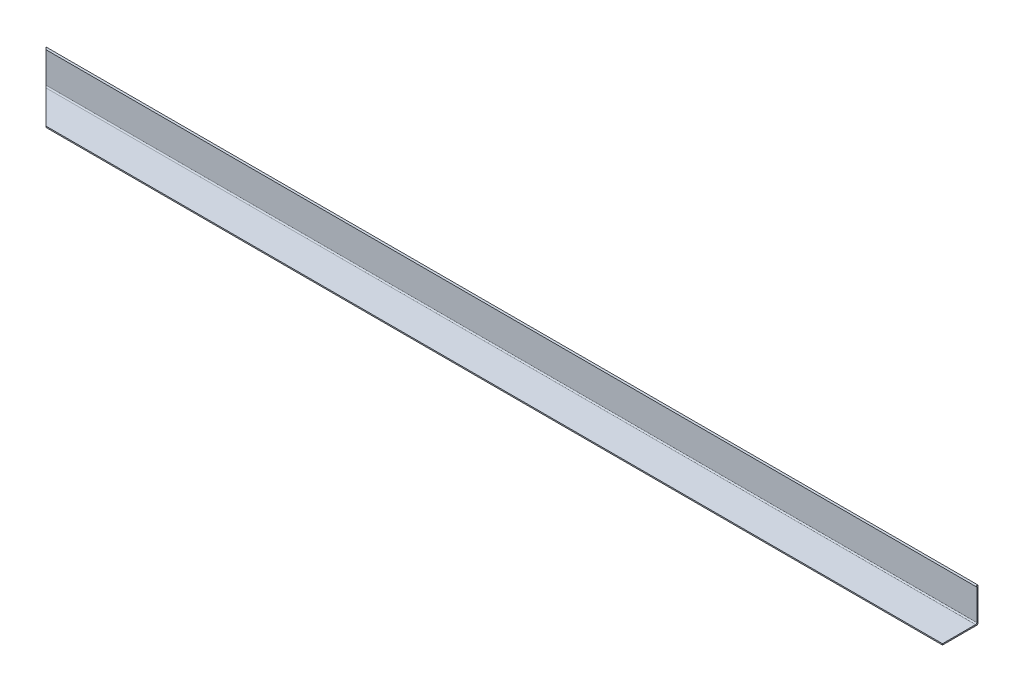
ISO-10303-21;
HEADER;
FILE_DESCRIPTION(('STEP AP214'),'2;1');
FILE_NAME('part.step','',(''),(''),'','','');
FILE_SCHEMA(('AUTOMOTIVE_DESIGN { 1 0 10303 214 1 1 1 1 }'));
ENDSEC;
DATA;
#1=APPLICATION_CONTEXT('core data for automotive mechanical design processes');
#2=APPLICATION_PROTOCOL_DEFINITION('international standard','automotive_design',2000,#1);
#3=PRODUCT_CONTEXT('',#1,'mechanical');
#4=PRODUCT('Part','Part','',(#3));
#5=PRODUCT_RELATED_PRODUCT_CATEGORY('part','',(#4));
#6=PRODUCT_DEFINITION_FORMATION('','',#4);
#7=PRODUCT_DEFINITION_CONTEXT('part definition',#1,'design');
#8=PRODUCT_DEFINITION('design','',#6,#7);
#9=PRODUCT_DEFINITION_SHAPE('','',#8);
#10=(LENGTH_UNIT() NAMED_UNIT(*) SI_UNIT(.MILLI.,.METRE.));
#11=(NAMED_UNIT(*) PLANE_ANGLE_UNIT() SI_UNIT($,.RADIAN.));
#12=(NAMED_UNIT(*) SI_UNIT($,.STERADIAN.) SOLID_ANGLE_UNIT());
#13=UNCERTAINTY_MEASURE_WITH_UNIT(LENGTH_MEASURE(1.E-05),#10,'distance_accuracy_value','');
#14=(GEOMETRIC_REPRESENTATION_CONTEXT(3) GLOBAL_UNCERTAINTY_ASSIGNED_CONTEXT((#13)) GLOBAL_UNIT_ASSIGNED_CONTEXT((#10,
#11,#12)) REPRESENTATION_CONTEXT('',''));
#15=CARTESIAN_POINT('',(0.,0.,0.));
#16=DIRECTION('',(0.,0.,1.));
#17=DIRECTION('',(1.,0.,0.));
#18=AXIS2_PLACEMENT_3D('',#15,#16,#17);
#19=CARTESIAN_POINT('',(2310.,0.,0.));
#20=DIRECTION('',(0.,0.,-1.));
#21=DIRECTION('',(-1.,0.,0.));
#22=AXIS2_PLACEMENT_3D('',#19,#20,#21);
#23=PLANE('',#22);
#24=DIRECTION('',(-1.,0.,0.));
#25=VECTOR('',#24,1.);
#26=CARTESIAN_POINT('',(2310.,0.,0.));
#27=LINE('',#26,#25);
#28=CARTESIAN_POINT('',(2310.,0.,0.));
#29=VERTEX_POINT('',#28);
#30=CARTESIAN_POINT('',(87.9999999999992,0.,0.));
#31=VERTEX_POINT('',#30);
#32=EDGE_CURVE('E138',#29,#31,#27,.T.);
#33=ORIENTED_EDGE('',*,*,#32,.T.);
#34=DIRECTION('',(0.,-1.,0.));
#35=VECTOR('',#34,1.);
#36=CARTESIAN_POINT('',(87.9999999999992,82.,0.));
#37=LINE('',#36,#35);
#38=CARTESIAN_POINT('',(87.9999999999992,-3.,0.));
#39=VERTEX_POINT('',#38);
#40=EDGE_CURVE('E179',#31,#39,#37,.T.);
#41=ORIENTED_EDGE('',*,*,#40,.T.);
#42=DIRECTION('',(-1.,0.,0.));
#43=VECTOR('',#42,1.);
#44=CARTESIAN_POINT('',(2310.,-3.,0.));
#45=LINE('',#44,#43);
#46=CARTESIAN_POINT('',(2310.,-3.,0.));
#47=VERTEX_POINT('',#46);
#48=EDGE_CURVE('E122',#47,#39,#45,.T.);
#49=ORIENTED_EDGE('',*,*,#48,.F.);
#50=DIRECTION('',(0.,-1.,0.));
#51=VECTOR('',#50,1.);
#52=CARTESIAN_POINT('',(2310.,0.,0.));
#53=LINE('',#52,#51);
#54=EDGE_CURVE('E133',#29,#47,#53,.T.);
#55=ORIENTED_EDGE('',*,*,#54,.F.);
#56=EDGE_LOOP('',(#33,#41,#49,#55));
#57=FACE_BOUND('',#56,.T.);
#58=ADVANCED_FACE('F33',(#57),#23,.F.);
#59=CARTESIAN_POINT('',(2310.,-3.,0.));
#60=DIRECTION('',(0.,1.,0.));
#61=DIRECTION('',(0.,0.,1.));
#62=AXIS2_PLACEMENT_3D('',#59,#60,#61);
#63=PLANE('',#62);
#64=ORIENTED_EDGE('',*,*,#48,.T.);
#65=DIRECTION('',(0.707106781186544,0.,0.707106781186551));
#66=VECTOR('',#65,1.);
#67=CARTESIAN_POINT('',(0.,-3.,-88.));
#68=LINE('',#67,#66);
#69=CARTESIAN_POINT('',(3.00000000000009,-3.,-84.9999999999999));
#70=VERTEX_POINT('',#69);
#71=EDGE_CURVE('E111',#70,#39,#68,.T.);
#72=ORIENTED_EDGE('',*,*,#71,.F.);
#73=DIRECTION('',(-1.,0.,0.));
#74=VECTOR('',#73,1.);
#75=CARTESIAN_POINT('',(2310.,-3.,-85.));
#76=LINE('',#75,#74);
#77=CARTESIAN_POINT('',(2310.,-3.,-85.));
#78=VERTEX_POINT('',#77);
#79=EDGE_CURVE('E146',#70,#78,#76,.F.);
#80=ORIENTED_EDGE('',*,*,#79,.T.);
#81=DIRECTION('',(0.,0.,-1.));
#82=VECTOR('',#81,1.);
#83=CARTESIAN_POINT('',(2310.,-3.,0.));
#84=LINE('',#83,#82);
#85=EDGE_CURVE('E129',#47,#78,#84,.T.);
#86=ORIENTED_EDGE('',*,*,#85,.F.);
#87=EDGE_LOOP('',(#64,#72,#80,#86));
#88=FACE_BOUND('',#87,.T.);
#89=ADVANCED_FACE('F182',(#88),#63,.F.);
#90=CARTESIAN_POINT('',(2310.,-3.,-88.));
#91=DIRECTION('',(0.,0.,1.));
#92=DIRECTION('',(1.,0.,0.));
#93=AXIS2_PLACEMENT_3D('',#90,#91,#92);
#94=PLANE('',#93);
#95=DIRECTION('',(0.,1.,0.));
#96=VECTOR('',#95,1.);
#97=CARTESIAN_POINT('',(2310.,-3.,-88.));
#98=LINE('',#97,#96);
#99=CARTESIAN_POINT('',(2310.,0.,-88.));
#100=VERTEX_POINT('',#99);
#101=CARTESIAN_POINT('',(2310.,82.,-88.));
#102=VERTEX_POINT('',#101);
#103=EDGE_CURVE('E118',#100,#102,#98,.T.);
#104=ORIENTED_EDGE('',*,*,#103,.F.);
#105=DIRECTION('',(-1.,0.,0.));
#106=VECTOR('',#105,1.);
#107=CARTESIAN_POINT('',(2310.,0.,-88.));
#108=LINE('',#107,#106);
#109=CARTESIAN_POINT('',(1.40946282423116E-13,0.,-88.));
#110=VERTEX_POINT('',#109);
#111=EDGE_CURVE('E121',#100,#110,#108,.T.);
#112=ORIENTED_EDGE('',*,*,#111,.T.);
#113=DIRECTION('',(0.,1.,0.));
#114=VECTOR('',#113,1.);
#115=CARTESIAN_POINT('',(0.,-3.,-88.));
#116=LINE('',#115,#114);
#117=CARTESIAN_POINT('',(0.,82.,-88.));
#118=VERTEX_POINT('',#117);
#119=EDGE_CURVE('E120',#110,#118,#116,.T.);
#120=ORIENTED_EDGE('',*,*,#119,.T.);
#121=DIRECTION('',(-1.,0.,0.));
#122=VECTOR('',#121,1.);
#123=CARTESIAN_POINT('',(2310.,82.,-88.));
#124=LINE('',#123,#122);
#125=EDGE_CURVE('E105',#118,#102,#124,.F.);
#126=ORIENTED_EDGE('',*,*,#125,.T.);
#127=EDGE_LOOP('',(#104,#112,#120,#126));
#128=FACE_BOUND('',#127,.T.);
#129=ADVANCED_FACE('F116',(#128),#94,.F.);
#130=CARTESIAN_POINT('',(2310.,0.,-85.));
#131=DIRECTION('',(0.,0.,-1.));
#132=DIRECTION('',(-1.,0.,0.));
#133=AXIS2_PLACEMENT_3D('',#130,#131,#132);
#134=PLANE('',#133);
#135=DIRECTION('',(-1.,0.,0.));
#136=VECTOR('',#135,1.);
#137=CARTESIAN_POINT('',(0.,79.,-85.));
#138=LINE('',#137,#136);
#139=CARTESIAN_POINT('',(2310.,79.,-85.));
#140=VERTEX_POINT('',#139);
#141=CARTESIAN_POINT('',(3.00000000000011,79.,-85.));
#142=VERTEX_POINT('',#141);
#143=EDGE_CURVE('E151',#140,#142,#138,.T.);
#144=ORIENTED_EDGE('',*,*,#143,.T.);
#145=DIRECTION('',(0.,-1.,0.));
#146=VECTOR('',#145,1.);
#147=CARTESIAN_POINT('',(3.00000000000011,0.,-85.));
#148=LINE('',#147,#146);
#149=CARTESIAN_POINT('',(3.00000000000011,3.,-85.));
#150=VERTEX_POINT('',#149);
#151=EDGE_CURVE('E168',#142,#150,#148,.T.);
#152=ORIENTED_EDGE('',*,*,#151,.T.);
#153=DIRECTION('',(-1.,0.,0.));
#154=VECTOR('',#153,1.);
#155=CARTESIAN_POINT('',(2310.,3.,-85.));
#156=LINE('',#155,#154);
#157=CARTESIAN_POINT('',(2310.,3.,-85.));
#158=VERTEX_POINT('',#157);
#159=EDGE_CURVE('E149',#150,#158,#156,.F.);
#160=ORIENTED_EDGE('',*,*,#159,.T.);
#161=DIRECTION('',(0.,-1.,0.));
#162=VECTOR('',#161,1.);
#163=CARTESIAN_POINT('',(2310.,0.,-85.));
#164=LINE('',#163,#162);
#165=EDGE_CURVE('E128',#140,#158,#164,.T.);
#166=ORIENTED_EDGE('',*,*,#165,.F.);
#167=EDGE_LOOP('',(#144,#152,#160,#166));
#168=FACE_BOUND('',#167,.T.);
#169=ADVANCED_FACE('F161',(#168),#134,.F.);
#170=CARTESIAN_POINT('',(2310.,0.,0.));
#171=DIRECTION('',(0.,-1.,0.));
#172=DIRECTION('',(0.,0.,-1.));
#173=AXIS2_PLACEMENT_3D('',#170,#171,#172);
#174=PLANE('',#173);
#175=DIRECTION('',(-1.,0.,0.));
#176=VECTOR('',#175,1.);
#177=CARTESIAN_POINT('',(0.,0.,-82.));
#178=LINE('',#177,#176);
#179=CARTESIAN_POINT('',(2310.,0.,-82.));
#180=VERTEX_POINT('',#179);
#181=CARTESIAN_POINT('',(6.00000000000023,0.,-82.));
#182=VERTEX_POINT('',#181);
#183=EDGE_CURVE('E155',#180,#182,#178,.T.);
#184=ORIENTED_EDGE('',*,*,#183,.T.);
#185=DIRECTION('',(0.707106781186544,0.,0.707106781186551));
#186=VECTOR('',#185,1.);
#187=CARTESIAN_POINT('',(1198.99999999999,0.,1111.));
#188=LINE('',#187,#186);
#189=EDGE_CURVE('E48',#182,#31,#188,.T.);
#190=ORIENTED_EDGE('',*,*,#189,.T.);
#191=ORIENTED_EDGE('',*,*,#32,.F.);
#192=DIRECTION('',(0.,0.,1.));
#193=VECTOR('',#192,1.);
#194=CARTESIAN_POINT('',(2310.,0.,0.));
#195=LINE('',#194,#193);
#196=EDGE_CURVE('E131',#180,#29,#195,.T.);
#197=ORIENTED_EDGE('',*,*,#196,.F.);
#198=EDGE_LOOP('',(#184,#190,#191,#197));
#199=FACE_BOUND('',#198,.T.);
#200=ADVANCED_FACE('F195',(#199),#174,.F.);
#201=CARTESIAN_POINT('',(2310.,0.,0.));
#202=DIRECTION('',(1.,0.,0.));
#203=DIRECTION('',(0.,0.,-1.));
#204=AXIS2_PLACEMENT_3D('',#201,#202,#203);
#205=PLANE('',#204);
#206=DIRECTION('',(0.,0.,1.));
#207=VECTOR('',#206,1.);
#208=CARTESIAN_POINT('',(2310.,82.,-88.));
#209=LINE('',#208,#207);
#210=CARTESIAN_POINT('',(2310.,82.,-82.));
#211=VERTEX_POINT('',#210);
#212=EDGE_CURVE('E102',#102,#211,#209,.T.);
#213=ORIENTED_EDGE('',*,*,#212,.T.);
#214=CARTESIAN_POINT('',(2310.,79.,-82.));
#215=DIRECTION('',(1.,0.,0.));
#216=DIRECTION('',(0.,0.,-1.));
#217=AXIS2_PLACEMENT_3D('',#214,#215,#216);
#218=CIRCLE('',#217,3.);
#219=EDGE_CURVE('E41',#211,#140,#218,.F.);
#220=ORIENTED_EDGE('',*,*,#219,.T.);
#221=ORIENTED_EDGE('',*,*,#165,.T.);
#222=CARTESIAN_POINT('',(2310.,3.,-82.));
#223=DIRECTION('',(1.,0.,0.));
#224=DIRECTION('',(0.,0.,-1.));
#225=AXIS2_PLACEMENT_3D('',#222,#223,#224);
#226=CIRCLE('',#225,3.);
#227=EDGE_CURVE('E11',#158,#180,#226,.F.);
#228=ORIENTED_EDGE('',*,*,#227,.T.);
#229=ORIENTED_EDGE('',*,*,#196,.T.);
#230=ORIENTED_EDGE('',*,*,#54,.T.);
#231=ORIENTED_EDGE('',*,*,#85,.T.);
#232=CARTESIAN_POINT('',(2310.,0.,-85.));
#233=DIRECTION('',(1.,0.,0.));
#234=DIRECTION('',(0.,0.,-1.));
#235=AXIS2_PLACEMENT_3D('',#232,#233,#234);
#236=CIRCLE('',#235,3.);
#237=EDGE_CURVE('E127',#78,#100,#236,.T.);
#238=ORIENTED_EDGE('',*,*,#237,.T.);
#239=ORIENTED_EDGE('',*,*,#103,.T.);
#240=EDGE_LOOP('',(#213,#220,#221,#228,#229,#230,#231,#238,#239));
#241=FACE_BOUND('',#240,.T.);
#242=ADVANCED_FACE('F124',(#241),#205,.T.);
#243=CARTESIAN_POINT('',(2310.,0.,-85.));
#244=DIRECTION('',(-1.,0.,0.));
#245=DIRECTION('',(0.,0.,1.));
#246=AXIS2_PLACEMENT_3D('',#243,#244,#245);
#247=CYLINDRICAL_SURFACE('',#246,3.);
#248=CARTESIAN_POINT('',(3.00000000000011,0.,-85.));
#249=DIRECTION('',(0.707106781186551,0.,-0.707106781186544));
#250=DIRECTION('',(-0.707106781186544,0.,-0.707106781186551));
#251=AXIS2_PLACEMENT_3D('',#248,#249,#250);
#252=ELLIPSE('',#251,4.24264068711927,3.);
#253=EDGE_CURVE('E140',#110,#70,#252,.F.);
#254=ORIENTED_EDGE('',*,*,#253,.F.);
#255=ORIENTED_EDGE('',*,*,#111,.F.);
#256=ORIENTED_EDGE('',*,*,#237,.F.);
#257=ORIENTED_EDGE('',*,*,#79,.F.);
#258=EDGE_LOOP('',(#254,#255,#256,#257));
#259=FACE_BOUND('',#258,.T.);
#260=ADVANCED_FACE('F186',(#259),#247,.T.);
#261=CARTESIAN_POINT('',(2310.,79.,-82.));
#262=DIRECTION('',(1.,0.,0.));
#263=DIRECTION('',(0.,0.,-1.));
#264=AXIS2_PLACEMENT_3D('',#261,#262,#263);
#265=CYLINDRICAL_SURFACE('',#264,3.);
#266=DIRECTION('',(-1.,0.,0.));
#267=VECTOR('',#266,1.);
#268=CARTESIAN_POINT('',(2310.,82.,-82.));
#269=LINE('',#268,#267);
#270=CARTESIAN_POINT('',(6.00000000000023,82.,-82.));
#271=VERTEX_POINT('',#270);
#272=EDGE_CURVE('E108',#271,#211,#269,.F.);
#273=ORIENTED_EDGE('',*,*,#272,.F.);
#274=CARTESIAN_POINT('',(6.00000000000023,79.,-82.));
#275=DIRECTION('',(0.707106781186551,0.,-0.707106781186544));
#276=DIRECTION('',(0.707106781186544,0.,0.707106781186551));
#277=AXIS2_PLACEMENT_3D('',#274,#275,#276);
#278=ELLIPSE('',#277,4.24264068711927,3.);
#279=EDGE_CURVE('E167',#271,#142,#278,.F.);
#280=ORIENTED_EDGE('',*,*,#279,.T.);
#281=ORIENTED_EDGE('',*,*,#143,.F.);
#282=ORIENTED_EDGE('',*,*,#219,.F.);
#283=EDGE_LOOP('',(#273,#280,#281,#282));
#284=FACE_BOUND('',#283,.T.);
#285=ADVANCED_FACE('F165',(#284),#265,.F.);
#286=CARTESIAN_POINT('',(2310.,3.,-82.));
#287=DIRECTION('',(1.,0.,0.));
#288=DIRECTION('',(0.,0.,-1.));
#289=AXIS2_PLACEMENT_3D('',#286,#287,#288);
#290=CYLINDRICAL_SURFACE('',#289,3.);
#291=ORIENTED_EDGE('',*,*,#159,.F.);
#292=CARTESIAN_POINT('',(6.00000000000023,3.,-82.));
#293=DIRECTION('',(0.707106781186551,0.,-0.707106781186544));
#294=DIRECTION('',(0.707106781186544,0.,0.707106781186551));
#295=AXIS2_PLACEMENT_3D('',#292,#293,#294);
#296=ELLIPSE('',#295,4.24264068711927,3.);
#297=EDGE_CURVE('E190',#150,#182,#296,.F.);
#298=ORIENTED_EDGE('',*,*,#297,.T.);
#299=ORIENTED_EDGE('',*,*,#183,.F.);
#300=ORIENTED_EDGE('',*,*,#227,.F.);
#301=EDGE_LOOP('',(#291,#298,#299,#300));
#302=FACE_BOUND('',#301,.T.);
#303=ADVANCED_FACE('F35',(#302),#290,.F.);
#304=CARTESIAN_POINT('',(0.,82.,-88.));
#305=DIRECTION('',(0.707106781186551,0.,-0.707106781186544));
#306=DIRECTION('',(-0.707106781186544,0.,-0.707106781186551));
#307=AXIS2_PLACEMENT_3D('',#304,#305,#306);
#308=PLANE('',#307);
#309=ORIENTED_EDGE('',*,*,#253,.T.);
#310=ORIENTED_EDGE('',*,*,#71,.T.);
#311=ORIENTED_EDGE('',*,*,#40,.F.);
#312=ORIENTED_EDGE('',*,*,#189,.F.);
#313=ORIENTED_EDGE('',*,*,#297,.F.);
#314=ORIENTED_EDGE('',*,*,#151,.F.);
#315=ORIENTED_EDGE('',*,*,#279,.F.);
#316=DIRECTION('',(0.707106781186544,0.,0.707106781186551));
#317=VECTOR('',#316,1.);
#318=CARTESIAN_POINT('',(0.,82.,-88.));
#319=LINE('',#318,#317);
#320=EDGE_CURVE('E188',#118,#271,#319,.T.);
#321=ORIENTED_EDGE('',*,*,#320,.F.);
#322=ORIENTED_EDGE('',*,*,#119,.F.);
#323=EDGE_LOOP('',(#309,#310,#311,#312,#313,#314,#315,#321,#322));
#324=FACE_BOUND('',#323,.T.);
#325=ADVANCED_FACE('F187',(#324),#308,.F.);
#326=CARTESIAN_POINT('',(2310.,82.,-88.));
#327=DIRECTION('',(0.,-1.,0.));
#328=DIRECTION('',(0.,0.,-1.));
#329=AXIS2_PLACEMENT_3D('',#326,#327,#328);
#330=PLANE('',#329);
#331=ORIENTED_EDGE('',*,*,#212,.F.);
#332=ORIENTED_EDGE('',*,*,#125,.F.);
#333=ORIENTED_EDGE('',*,*,#320,.T.);
#334=ORIENTED_EDGE('',*,*,#272,.T.);
#335=EDGE_LOOP('',(#331,#332,#333,#334));
#336=FACE_BOUND('',#335,.T.);
#337=ADVANCED_FACE('F104',(#336),#330,.F.);
#338=CLOSED_SHELL('',(#58,#89,#129,#169,#200,#242,#260,#285,#303,#325,#337));
#339=MANIFOLD_SOLID_BREP('B2',#338);
#340=ADVANCED_BREP_SHAPE_REPRESENTATION('',(#18,#339),#14);
#341=SHAPE_DEFINITION_REPRESENTATION(#9,#340);
ENDSEC;
END-ISO-10303-21;
